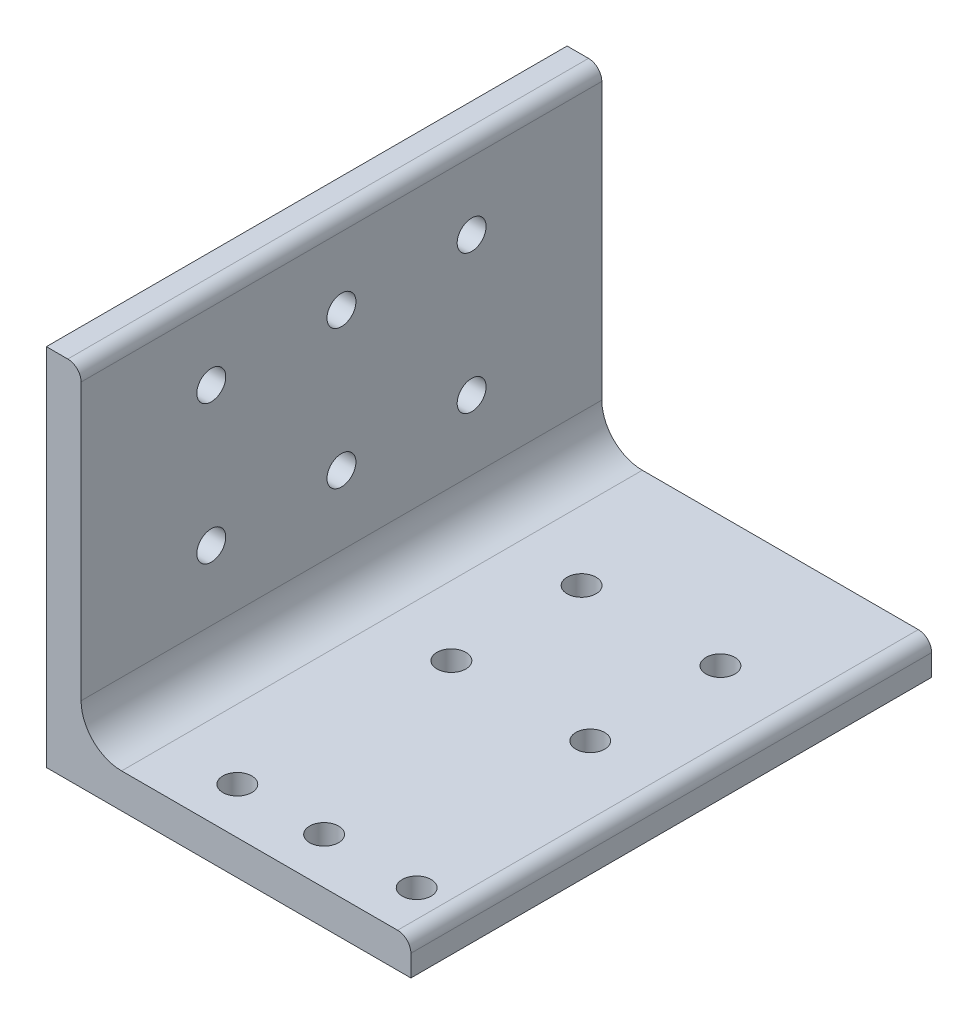
ISO-10303-21;
HEADER;
FILE_DESCRIPTION(('STEP AP214'),'2;1');
FILE_NAME('part.step','',(''),(''),'','','');
FILE_SCHEMA(('AUTOMOTIVE_DESIGN { 1 0 10303 214 1 1 1 1 }'));
ENDSEC;
DATA;
#1=APPLICATION_CONTEXT('core data for automotive mechanical design processes');
#2=APPLICATION_PROTOCOL_DEFINITION('international standard','automotive_design',2000,#1);
#3=PRODUCT_CONTEXT('',#1,'mechanical');
#4=PRODUCT('Part','Part','',(#3));
#5=PRODUCT_RELATED_PRODUCT_CATEGORY('part','',(#4));
#6=PRODUCT_DEFINITION_FORMATION('','',#4);
#7=PRODUCT_DEFINITION_CONTEXT('part definition',#1,'design');
#8=PRODUCT_DEFINITION('design','',#6,#7);
#9=PRODUCT_DEFINITION_SHAPE('','',#8);
#10=(LENGTH_UNIT() NAMED_UNIT(*) SI_UNIT(.MILLI.,.METRE.));
#11=(NAMED_UNIT(*) PLANE_ANGLE_UNIT() SI_UNIT($,.RADIAN.));
#12=(NAMED_UNIT(*) SI_UNIT($,.STERADIAN.) SOLID_ANGLE_UNIT());
#13=UNCERTAINTY_MEASURE_WITH_UNIT(LENGTH_MEASURE(1.E-05),#10,'distance_accuracy_value','');
#14=(GEOMETRIC_REPRESENTATION_CONTEXT(3) GLOBAL_UNCERTAINTY_ASSIGNED_CONTEXT((#13)) GLOBAL_UNIT_ASSIGNED_CONTEXT((#10,
#11,#12)) REPRESENTATION_CONTEXT('',''));
#15=CARTESIAN_POINT('',(0.,0.,0.));
#16=DIRECTION('',(0.,0.,1.));
#17=DIRECTION('',(1.,0.,0.));
#18=AXIS2_PLACEMENT_3D('',#15,#16,#17);
#19=CARTESIAN_POINT('',(0.,0.,90.));
#20=DIRECTION('',(-1.,0.,0.));
#21=DIRECTION('',(0.,0.,1.));
#22=AXIS2_PLACEMENT_3D('',#19,#20,#21);
#23=PLANE('',#22);
#24=CARTESIAN_POINT('',(0.,25.,67.5));
#25=DIRECTION('',(1.,0.,0.));
#26=DIRECTION('',(0.,0.,-1.));
#27=AXIS2_PLACEMENT_3D('',#24,#25,#26);
#28=CIRCLE('',#27,2.5);
#29=CARTESIAN_POINT('',(0.,25.,65.));
#30=VERTEX_POINT('',#29);
#31=EDGE_CURVE('E294',#30,#30,#28,.T.);
#32=ORIENTED_EDGE('',*,*,#31,.T.);
#33=EDGE_LOOP('',(#32));
#34=FACE_BOUND('',#33,.T.);
#35=DIRECTION('',(0.,1.,0.));
#36=VECTOR('',#35,1.);
#37=CARTESIAN_POINT('',(0.,0.,0.));
#38=LINE('',#37,#36);
#39=CARTESIAN_POINT('',(0.,0.,0.));
#40=VERTEX_POINT('',#39);
#41=CARTESIAN_POINT('',(0.,63.,0.));
#42=VERTEX_POINT('',#41);
#43=EDGE_CURVE('E145',#40,#42,#38,.T.);
#44=ORIENTED_EDGE('',*,*,#43,.F.);
#45=DIRECTION('',(0.,0.,-1.));
#46=VECTOR('',#45,1.);
#47=CARTESIAN_POINT('',(0.,0.,90.));
#48=LINE('',#47,#46);
#49=CARTESIAN_POINT('',(0.,0.,90.));
#50=VERTEX_POINT('',#49);
#51=EDGE_CURVE('E160',#50,#40,#48,.T.);
#52=ORIENTED_EDGE('',*,*,#51,.F.);
#53=DIRECTION('',(0.,1.,0.));
#54=VECTOR('',#53,1.);
#55=CARTESIAN_POINT('',(0.,0.,90.));
#56=LINE('',#55,#54);
#57=CARTESIAN_POINT('',(0.,63.,90.));
#58=VERTEX_POINT('',#57);
#59=EDGE_CURVE('E252',#50,#58,#56,.T.);
#60=ORIENTED_EDGE('',*,*,#59,.T.);
#61=DIRECTION('',(0.,0.,-1.));
#62=VECTOR('',#61,1.);
#63=CARTESIAN_POINT('',(0.,63.,90.));
#64=LINE('',#63,#62);
#65=EDGE_CURVE('E162',#58,#42,#64,.T.);
#66=ORIENTED_EDGE('',*,*,#65,.T.);
#67=EDGE_LOOP('',(#44,#52,#60,#66));
#68=FACE_BOUND('',#67,.T.);
#69=CARTESIAN_POINT('',(0.,49.,22.5000000000001));
#70=DIRECTION('',(1.,0.,0.));
#71=DIRECTION('',(0.,0.,-1.));
#72=AXIS2_PLACEMENT_3D('',#69,#70,#71);
#73=CIRCLE('',#72,2.5);
#74=CARTESIAN_POINT('',(0.,49.,20.0000000000001));
#75=VERTEX_POINT('',#74);
#76=EDGE_CURVE('E136',#75,#75,#73,.T.);
#77=ORIENTED_EDGE('',*,*,#76,.T.);
#78=EDGE_LOOP('',(#77));
#79=FACE_BOUND('',#78,.T.);
#80=CARTESIAN_POINT('',(0.,25.,22.5));
#81=DIRECTION('',(1.,0.,0.));
#82=DIRECTION('',(0.,0.,-1.));
#83=AXIS2_PLACEMENT_3D('',#80,#81,#82);
#84=CIRCLE('',#83,2.5);
#85=CARTESIAN_POINT('',(0.,25.,20.));
#86=VERTEX_POINT('',#85);
#87=EDGE_CURVE('E238',#86,#86,#84,.T.);
#88=ORIENTED_EDGE('',*,*,#87,.T.);
#89=EDGE_LOOP('',(#88));
#90=FACE_BOUND('',#89,.T.);
#91=CARTESIAN_POINT('',(0.,25.,45.));
#92=DIRECTION('',(1.,0.,0.));
#93=DIRECTION('',(0.,0.,-1.));
#94=AXIS2_PLACEMENT_3D('',#91,#92,#93);
#95=CIRCLE('',#94,2.5);
#96=CARTESIAN_POINT('',(0.,25.,42.5));
#97=VERTEX_POINT('',#96);
#98=EDGE_CURVE('E310',#97,#97,#95,.T.);
#99=ORIENTED_EDGE('',*,*,#98,.T.);
#100=EDGE_LOOP('',(#99));
#101=FACE_BOUND('',#100,.T.);
#102=CARTESIAN_POINT('',(0.,49.,45.));
#103=DIRECTION('',(1.,0.,0.));
#104=DIRECTION('',(0.,0.,-1.));
#105=AXIS2_PLACEMENT_3D('',#102,#103,#104);
#106=CIRCLE('',#105,2.5);
#107=CARTESIAN_POINT('',(0.,49.,42.5));
#108=VERTEX_POINT('',#107);
#109=EDGE_CURVE('E306',#108,#108,#106,.T.);
#110=ORIENTED_EDGE('',*,*,#109,.T.);
#111=EDGE_LOOP('',(#110));
#112=FACE_BOUND('',#111,.T.);
#113=CARTESIAN_POINT('',(0.,49.,67.5));
#114=DIRECTION('',(1.,0.,0.));
#115=DIRECTION('',(0.,0.,-1.));
#116=AXIS2_PLACEMENT_3D('',#113,#114,#115);
#117=CIRCLE('',#116,2.5);
#118=CARTESIAN_POINT('',(0.,49.,65.));
#119=VERTEX_POINT('',#118);
#120=EDGE_CURVE('E302',#119,#119,#117,.T.);
#121=ORIENTED_EDGE('',*,*,#120,.T.);
#122=EDGE_LOOP('',(#121));
#123=FACE_BOUND('',#122,.T.);
#124=ADVANCED_FACE('F32',(#34,#68,#79,#90,#101,#112,#123),#23,.T.);
#125=CARTESIAN_POINT('',(13.,13.,90.));
#126=DIRECTION('',(0.,0.,-1.));
#127=DIRECTION('',(-1.,0.,0.));
#128=AXIS2_PLACEMENT_3D('',#125,#126,#127);
#129=CYLINDRICAL_SURFACE('',#128,7.);
#130=CARTESIAN_POINT('',(13.,13.,0.));
#131=DIRECTION('',(0.,0.,1.));
#132=DIRECTION('',(1.,0.,0.));
#133=AXIS2_PLACEMENT_3D('',#130,#131,#132);
#134=CIRCLE('',#133,7.);
#135=CARTESIAN_POINT('',(6.,13.,0.));
#136=VERTEX_POINT('',#135);
#137=CARTESIAN_POINT('',(13.,6.,0.));
#138=VERTEX_POINT('',#137);
#139=EDGE_CURVE('E133',#136,#138,#134,.T.);
#140=ORIENTED_EDGE('',*,*,#139,.F.);
#141=DIRECTION('',(0.,0.,-1.));
#142=VECTOR('',#141,1.);
#143=CARTESIAN_POINT('',(6.,13.,90.));
#144=LINE('',#143,#142);
#145=CARTESIAN_POINT('',(6.,13.,90.));
#146=VERTEX_POINT('',#145);
#147=EDGE_CURVE('E11',#146,#136,#144,.T.);
#148=ORIENTED_EDGE('',*,*,#147,.F.);
#149=CARTESIAN_POINT('',(13.,13.,90.));
#150=DIRECTION('',(0.,0.,1.));
#151=DIRECTION('',(1.,0.,0.));
#152=AXIS2_PLACEMENT_3D('',#149,#150,#151);
#153=CIRCLE('',#152,7.);
#154=CARTESIAN_POINT('',(13.,6.,90.));
#155=VERTEX_POINT('',#154);
#156=EDGE_CURVE('E156',#146,#155,#153,.T.);
#157=ORIENTED_EDGE('',*,*,#156,.T.);
#158=DIRECTION('',(0.,0.,-1.));
#159=VECTOR('',#158,1.);
#160=CARTESIAN_POINT('',(13.,6.,90.));
#161=LINE('',#160,#159);
#162=EDGE_CURVE('E49',#155,#138,#161,.T.);
#163=ORIENTED_EDGE('',*,*,#162,.T.);
#164=EDGE_LOOP('',(#140,#148,#157,#163));
#165=FACE_BOUND('',#164,.T.);
#166=ADVANCED_FACE('F34',(#165),#129,.F.);
#167=CARTESIAN_POINT('',(6.,0.,90.));
#168=DIRECTION('',(1.,0.,0.));
#169=DIRECTION('',(0.,1.,0.));
#170=AXIS2_PLACEMENT_3D('',#167,#168,#169);
#171=PLANE('',#170);
#172=CARTESIAN_POINT('',(6.,25.,67.5));
#173=DIRECTION('',(1.,0.,0.));
#174=DIRECTION('',(0.,0.,-1.));
#175=AXIS2_PLACEMENT_3D('',#172,#173,#174);
#176=CIRCLE('',#175,2.5);
#177=CARTESIAN_POINT('',(6.,25.,65.));
#178=VERTEX_POINT('',#177);
#179=EDGE_CURVE('E217',#178,#178,#176,.T.);
#180=ORIENTED_EDGE('',*,*,#179,.F.);
#181=EDGE_LOOP('',(#180));
#182=FACE_BOUND('',#181,.T.);
#183=CARTESIAN_POINT('',(6.,49.,67.5));
#184=DIRECTION('',(1.,0.,0.));
#185=DIRECTION('',(0.,0.,-1.));
#186=AXIS2_PLACEMENT_3D('',#183,#184,#185);
#187=CIRCLE('',#186,2.5);
#188=CARTESIAN_POINT('',(6.,49.,65.));
#189=VERTEX_POINT('',#188);
#190=EDGE_CURVE('E221',#189,#189,#187,.T.);
#191=ORIENTED_EDGE('',*,*,#190,.F.);
#192=EDGE_LOOP('',(#191));
#193=FACE_BOUND('',#192,.T.);
#194=CARTESIAN_POINT('',(6.,49.,45.));
#195=DIRECTION('',(1.,0.,0.));
#196=DIRECTION('',(0.,0.,-1.));
#197=AXIS2_PLACEMENT_3D('',#194,#195,#196);
#198=CIRCLE('',#197,2.5);
#199=CARTESIAN_POINT('',(6.,49.,42.5));
#200=VERTEX_POINT('',#199);
#201=EDGE_CURVE('E225',#200,#200,#198,.T.);
#202=ORIENTED_EDGE('',*,*,#201,.F.);
#203=EDGE_LOOP('',(#202));
#204=FACE_BOUND('',#203,.T.);
#205=CARTESIAN_POINT('',(6.,25.,45.));
#206=DIRECTION('',(1.,0.,0.));
#207=DIRECTION('',(0.,0.,-1.));
#208=AXIS2_PLACEMENT_3D('',#205,#206,#207);
#209=CIRCLE('',#208,2.5);
#210=CARTESIAN_POINT('',(6.,25.,42.5));
#211=VERTEX_POINT('',#210);
#212=EDGE_CURVE('E229',#211,#211,#209,.T.);
#213=ORIENTED_EDGE('',*,*,#212,.F.);
#214=EDGE_LOOP('',(#213));
#215=FACE_BOUND('',#214,.T.);
#216=CARTESIAN_POINT('',(6.,25.,22.5));
#217=DIRECTION('',(1.,0.,0.));
#218=DIRECTION('',(0.,0.,-1.));
#219=AXIS2_PLACEMENT_3D('',#216,#217,#218);
#220=CIRCLE('',#219,2.5);
#221=CARTESIAN_POINT('',(6.,25.,20.));
#222=VERTEX_POINT('',#221);
#223=EDGE_CURVE('E233',#222,#222,#220,.T.);
#224=ORIENTED_EDGE('',*,*,#223,.F.);
#225=EDGE_LOOP('',(#224));
#226=FACE_BOUND('',#225,.T.);
#227=CARTESIAN_POINT('',(6.,49.,22.5000000000001));
#228=DIRECTION('',(1.,0.,0.));
#229=DIRECTION('',(0.,0.,-1.));
#230=AXIS2_PLACEMENT_3D('',#227,#228,#229);
#231=CIRCLE('',#230,2.5);
#232=CARTESIAN_POINT('',(6.,49.,20.0000000000001));
#233=VERTEX_POINT('',#232);
#234=EDGE_CURVE('E236',#233,#233,#231,.T.);
#235=ORIENTED_EDGE('',*,*,#234,.F.);
#236=EDGE_LOOP('',(#235));
#237=FACE_BOUND('',#236,.T.);
#238=DIRECTION('',(0.,-1.,0.));
#239=VECTOR('',#238,1.);
#240=CARTESIAN_POINT('',(6.,0.,0.));
#241=LINE('',#240,#239);
#242=CARTESIAN_POINT('',(6.,60.7,0.));
#243=VERTEX_POINT('',#242);
#244=EDGE_CURVE('E135',#243,#136,#241,.T.);
#245=ORIENTED_EDGE('',*,*,#244,.F.);
#246=DIRECTION('',(0.,0.,-1.));
#247=VECTOR('',#246,1.);
#248=CARTESIAN_POINT('',(6.,60.7,90.));
#249=LINE('',#248,#247);
#250=CARTESIAN_POINT('',(6.,60.7,90.));
#251=VERTEX_POINT('',#250);
#252=EDGE_CURVE('E41',#251,#243,#249,.T.);
#253=ORIENTED_EDGE('',*,*,#252,.F.);
#254=DIRECTION('',(0.,-1.,0.));
#255=VECTOR('',#254,1.);
#256=CARTESIAN_POINT('',(6.,0.,90.));
#257=LINE('',#256,#255);
#258=EDGE_CURVE('E179',#251,#146,#257,.T.);
#259=ORIENTED_EDGE('',*,*,#258,.T.);
#260=ORIENTED_EDGE('',*,*,#147,.T.);
#261=EDGE_LOOP('',(#245,#253,#259,#260));
#262=FACE_BOUND('',#261,.T.);
#263=ADVANCED_FACE('F178',(#182,#193,#204,#215,#226,#237,#262),#171,.T.);
#264=CARTESIAN_POINT('',(3.7,60.7,90.));
#265=DIRECTION('',(0.,0.,-1.));
#266=DIRECTION('',(-1.,0.,0.));
#267=AXIS2_PLACEMENT_3D('',#264,#265,#266);
#268=CYLINDRICAL_SURFACE('',#267,2.3);
#269=CARTESIAN_POINT('',(3.7,60.7,0.));
#270=DIRECTION('',(0.,0.,1.));
#271=DIRECTION('',(1.,0.,0.));
#272=AXIS2_PLACEMENT_3D('',#269,#270,#271);
#273=CIRCLE('',#272,2.3);
#274=CARTESIAN_POINT('',(3.69999999999999,63.,0.));
#275=VERTEX_POINT('',#274);
#276=EDGE_CURVE('E139',#243,#275,#273,.T.);
#277=ORIENTED_EDGE('',*,*,#276,.T.);
#278=DIRECTION('',(0.,0.,-1.));
#279=VECTOR('',#278,1.);
#280=CARTESIAN_POINT('',(3.69999999999999,63.,90.));
#281=LINE('',#280,#279);
#282=CARTESIAN_POINT('',(3.69999999999999,63.,90.));
#283=VERTEX_POINT('',#282);
#284=EDGE_CURVE('E164',#283,#275,#281,.T.);
#285=ORIENTED_EDGE('',*,*,#284,.F.);
#286=CARTESIAN_POINT('',(3.7,60.7,90.));
#287=DIRECTION('',(0.,0.,1.));
#288=DIRECTION('',(1.,0.,0.));
#289=AXIS2_PLACEMENT_3D('',#286,#287,#288);
#290=CIRCLE('',#289,2.3);
#291=EDGE_CURVE('E170',#251,#283,#290,.T.);
#292=ORIENTED_EDGE('',*,*,#291,.F.);
#293=ORIENTED_EDGE('',*,*,#252,.T.);
#294=EDGE_LOOP('',(#277,#285,#292,#293));
#295=FACE_BOUND('',#294,.T.);
#296=ADVANCED_FACE('F168',(#295),#268,.T.);
#297=CARTESIAN_POINT('',(0.,63.,90.));
#298=DIRECTION('',(0.,1.,0.));
#299=DIRECTION('',(0.,0.,1.));
#300=AXIS2_PLACEMENT_3D('',#297,#298,#299);
#301=PLANE('',#300);
#302=DIRECTION('',(1.,0.,0.));
#303=VECTOR('',#302,1.);
#304=CARTESIAN_POINT('',(0.,63.,0.));
#305=LINE('',#304,#303);
#306=EDGE_CURVE('E142',#42,#275,#305,.T.);
#307=ORIENTED_EDGE('',*,*,#306,.F.);
#308=ORIENTED_EDGE('',*,*,#65,.F.);
#309=DIRECTION('',(1.,0.,0.));
#310=VECTOR('',#309,1.);
#311=CARTESIAN_POINT('',(0.,63.,90.));
#312=LINE('',#311,#310);
#313=EDGE_CURVE('E249',#58,#283,#312,.T.);
#314=ORIENTED_EDGE('',*,*,#313,.T.);
#315=ORIENTED_EDGE('',*,*,#284,.T.);
#316=EDGE_LOOP('',(#307,#308,#314,#315));
#317=FACE_BOUND('',#316,.T.);
#318=ADVANCED_FACE('F205',(#317),#301,.T.);
#319=CARTESIAN_POINT('',(0.,0.,90.));
#320=DIRECTION('',(0.,1.,0.));
#321=DIRECTION('',(0.,0.,1.));
#322=AXIS2_PLACEMENT_3D('',#319,#320,#321);
#323=PLANE('',#322);
#324=CARTESIAN_POINT('',(56.,0.,82.));
#325=DIRECTION('',(0.,1.,0.));
#326=DIRECTION('',(0.,0.,1.));
#327=AXIS2_PLACEMENT_3D('',#324,#325,#326);
#328=CIRCLE('',#327,2.5);
#329=CARTESIAN_POINT('',(56.,0.,84.5));
#330=VERTEX_POINT('',#329);
#331=EDGE_CURVE('E267',#330,#330,#328,.T.);
#332=ORIENTED_EDGE('',*,*,#331,.T.);
#333=EDGE_LOOP('',(#332));
#334=FACE_BOUND('',#333,.T.);
#335=CARTESIAN_POINT('',(40.,0.,82.));
#336=DIRECTION('',(0.,1.,0.));
#337=DIRECTION('',(0.,0.,1.));
#338=AXIS2_PLACEMENT_3D('',#335,#336,#337);
#339=CIRCLE('',#338,2.5);
#340=CARTESIAN_POINT('',(40.,0.,84.5));
#341=VERTEX_POINT('',#340);
#342=EDGE_CURVE('E271',#341,#341,#339,.T.);
#343=ORIENTED_EDGE('',*,*,#342,.T.);
#344=EDGE_LOOP('',(#343));
#345=FACE_BOUND('',#344,.T.);
#346=CARTESIAN_POINT('',(25.,0.,22.5));
#347=DIRECTION('',(0.,1.,0.));
#348=DIRECTION('',(0.,0.,1.));
#349=AXIS2_PLACEMENT_3D('',#346,#347,#348);
#350=CIRCLE('',#349,2.5);
#351=CARTESIAN_POINT('',(25.,0.,25.));
#352=VERTEX_POINT('',#351);
#353=EDGE_CURVE('E275',#352,#352,#350,.T.);
#354=ORIENTED_EDGE('',*,*,#353,.T.);
#355=EDGE_LOOP('',(#354));
#356=FACE_BOUND('',#355,.T.);
#357=CARTESIAN_POINT('',(49.,0.,22.5));
#358=DIRECTION('',(0.,1.,0.));
#359=DIRECTION('',(0.,0.,1.));
#360=AXIS2_PLACEMENT_3D('',#357,#358,#359);
#361=CIRCLE('',#360,2.5);
#362=CARTESIAN_POINT('',(49.,0.,25.));
#363=VERTEX_POINT('',#362);
#364=EDGE_CURVE('E279',#363,#363,#361,.T.);
#365=ORIENTED_EDGE('',*,*,#364,.T.);
#366=EDGE_LOOP('',(#365));
#367=FACE_BOUND('',#366,.T.);
#368=CARTESIAN_POINT('',(49.,0.,45.));
#369=DIRECTION('',(0.,1.,0.));
#370=DIRECTION('',(0.,0.,1.));
#371=AXIS2_PLACEMENT_3D('',#368,#369,#370);
#372=CIRCLE('',#371,2.5);
#373=CARTESIAN_POINT('',(49.,0.,47.5));
#374=VERTEX_POINT('',#373);
#375=EDGE_CURVE('E283',#374,#374,#372,.T.);
#376=ORIENTED_EDGE('',*,*,#375,.T.);
#377=EDGE_LOOP('',(#376));
#378=FACE_BOUND('',#377,.T.);
#379=CARTESIAN_POINT('',(25.,0.,45.));
#380=DIRECTION('',(0.,1.,0.));
#381=DIRECTION('',(0.,0.,1.));
#382=AXIS2_PLACEMENT_3D('',#379,#380,#381);
#383=CIRCLE('',#382,2.5);
#384=CARTESIAN_POINT('',(25.,0.,47.5));
#385=VERTEX_POINT('',#384);
#386=EDGE_CURVE('E287',#385,#385,#383,.T.);
#387=ORIENTED_EDGE('',*,*,#386,.T.);
#388=EDGE_LOOP('',(#387));
#389=FACE_BOUND('',#388,.T.);
#390=CARTESIAN_POINT('',(25.,0.,82.));
#391=DIRECTION('',(0.,1.,0.));
#392=DIRECTION('',(0.,0.,1.));
#393=AXIS2_PLACEMENT_3D('',#390,#391,#392);
#394=CIRCLE('',#393,2.5);
#395=CARTESIAN_POINT('',(25.,0.,84.5));
#396=VERTEX_POINT('',#395);
#397=EDGE_CURVE('E290',#396,#396,#394,.T.);
#398=ORIENTED_EDGE('',*,*,#397,.T.);
#399=EDGE_LOOP('',(#398));
#400=FACE_BOUND('',#399,.T.);
#401=DIRECTION('',(1.,0.,0.));
#402=VECTOR('',#401,1.);
#403=CARTESIAN_POINT('',(0.,0.,0.));
#404=LINE('',#403,#402);
#405=CARTESIAN_POINT('',(63.,0.,0.));
#406=VERTEX_POINT('',#405);
#407=EDGE_CURVE('E148',#40,#406,#404,.T.);
#408=ORIENTED_EDGE('',*,*,#407,.T.);
#409=DIRECTION('',(0.,0.,-1.));
#410=VECTOR('',#409,1.);
#411=CARTESIAN_POINT('',(63.,0.,90.));
#412=LINE('',#411,#410);
#413=CARTESIAN_POINT('',(63.,0.,90.));
#414=VERTEX_POINT('',#413);
#415=EDGE_CURVE('E125',#414,#406,#412,.T.);
#416=ORIENTED_EDGE('',*,*,#415,.F.);
#417=DIRECTION('',(1.,0.,0.));
#418=VECTOR('',#417,1.);
#419=CARTESIAN_POINT('',(0.,0.,90.));
#420=LINE('',#419,#418);
#421=EDGE_CURVE('E113',#50,#414,#420,.T.);
#422=ORIENTED_EDGE('',*,*,#421,.F.);
#423=ORIENTED_EDGE('',*,*,#51,.T.);
#424=EDGE_LOOP('',(#408,#416,#422,#423));
#425=FACE_BOUND('',#424,.T.);
#426=ADVANCED_FACE('F203',(#334,#345,#356,#367,#378,#389,#400,#425),#323,.F.);
#427=CARTESIAN_POINT('',(63.,0.,90.));
#428=DIRECTION('',(-1.,0.,0.));
#429=DIRECTION('',(0.,0.,1.));
#430=AXIS2_PLACEMENT_3D('',#427,#428,#429);
#431=PLANE('',#430);
#432=DIRECTION('',(0.,1.,0.));
#433=VECTOR('',#432,1.);
#434=CARTESIAN_POINT('',(63.,0.,0.));
#435=LINE('',#434,#433);
#436=CARTESIAN_POINT('',(63.,3.69999999999998,0.));
#437=VERTEX_POINT('',#436);
#438=EDGE_CURVE('E122',#406,#437,#435,.T.);
#439=ORIENTED_EDGE('',*,*,#438,.T.);
#440=DIRECTION('',(0.,0.,-1.));
#441=VECTOR('',#440,1.);
#442=CARTESIAN_POINT('',(63.,3.69999999999998,90.));
#443=LINE('',#442,#441);
#444=CARTESIAN_POINT('',(63.,3.69999999999998,90.));
#445=VERTEX_POINT('',#444);
#446=EDGE_CURVE('E119',#445,#437,#443,.T.);
#447=ORIENTED_EDGE('',*,*,#446,.F.);
#448=DIRECTION('',(0.,1.,0.));
#449=VECTOR('',#448,1.);
#450=CARTESIAN_POINT('',(63.,0.,90.));
#451=LINE('',#450,#449);
#452=EDGE_CURVE('E105',#414,#445,#451,.T.);
#453=ORIENTED_EDGE('',*,*,#452,.F.);
#454=ORIENTED_EDGE('',*,*,#415,.T.);
#455=EDGE_LOOP('',(#439,#447,#453,#454));
#456=FACE_BOUND('',#455,.T.);
#457=ADVANCED_FACE('F120',(#456),#431,.F.);
#458=CARTESIAN_POINT('',(60.7,3.7,90.));
#459=DIRECTION('',(0.,0.,-1.));
#460=DIRECTION('',(-1.,0.,0.));
#461=AXIS2_PLACEMENT_3D('',#458,#459,#460);
#462=CYLINDRICAL_SURFACE('',#461,2.3);
#463=CARTESIAN_POINT('',(60.7,3.7,0.));
#464=DIRECTION('',(0.,0.,1.));
#465=DIRECTION('',(1.,0.,0.));
#466=AXIS2_PLACEMENT_3D('',#463,#464,#465);
#467=CIRCLE('',#466,2.3);
#468=CARTESIAN_POINT('',(60.7,6.,0.));
#469=VERTEX_POINT('',#468);
#470=EDGE_CURVE('E151',#437,#469,#467,.T.);
#471=ORIENTED_EDGE('',*,*,#470,.T.);
#472=DIRECTION('',(0.,0.,-1.));
#473=VECTOR('',#472,1.);
#474=CARTESIAN_POINT('',(60.7,6.,90.));
#475=LINE('',#474,#473);
#476=CARTESIAN_POINT('',(60.7,6.,90.));
#477=VERTEX_POINT('',#476);
#478=EDGE_CURVE('E78',#477,#469,#475,.T.);
#479=ORIENTED_EDGE('',*,*,#478,.F.);
#480=CARTESIAN_POINT('',(60.7,3.7,90.));
#481=DIRECTION('',(0.,0.,1.));
#482=DIRECTION('',(1.,0.,0.));
#483=AXIS2_PLACEMENT_3D('',#480,#481,#482);
#484=CIRCLE('',#483,2.3);
#485=EDGE_CURVE('E110',#445,#477,#484,.T.);
#486=ORIENTED_EDGE('',*,*,#485,.F.);
#487=ORIENTED_EDGE('',*,*,#446,.T.);
#488=EDGE_LOOP('',(#471,#479,#486,#487));
#489=FACE_BOUND('',#488,.T.);
#490=ADVANCED_FACE('F127',(#489),#462,.T.);
#491=CARTESIAN_POINT('',(0.,6.,90.));
#492=DIRECTION('',(0.,1.,0.));
#493=DIRECTION('',(0.,0.,1.));
#494=AXIS2_PLACEMENT_3D('',#491,#492,#493);
#495=PLANE('',#494);
#496=CARTESIAN_POINT('',(56.,6.,82.));
#497=DIRECTION('',(0.,1.,0.));
#498=DIRECTION('',(0.,0.,1.));
#499=AXIS2_PLACEMENT_3D('',#496,#497,#498);
#500=CIRCLE('',#499,2.5);
#501=CARTESIAN_POINT('',(56.,6.,84.5));
#502=VERTEX_POINT('',#501);
#503=EDGE_CURVE('E467',#502,#502,#500,.T.);
#504=ORIENTED_EDGE('',*,*,#503,.F.);
#505=EDGE_LOOP('',(#504));
#506=FACE_BOUND('',#505,.T.);
#507=CARTESIAN_POINT('',(40.,6.,82.));
#508=DIRECTION('',(0.,1.,0.));
#509=DIRECTION('',(0.,0.,1.));
#510=AXIS2_PLACEMENT_3D('',#507,#508,#509);
#511=CIRCLE('',#510,2.5);
#512=CARTESIAN_POINT('',(40.,6.,84.5));
#513=VERTEX_POINT('',#512);
#514=EDGE_CURVE('E469',#513,#513,#511,.T.);
#515=ORIENTED_EDGE('',*,*,#514,.F.);
#516=EDGE_LOOP('',(#515));
#517=FACE_BOUND('',#516,.T.);
#518=CARTESIAN_POINT('',(25.,6.,22.5));
#519=DIRECTION('',(0.,1.,0.));
#520=DIRECTION('',(0.,0.,1.));
#521=AXIS2_PLACEMENT_3D('',#518,#519,#520);
#522=CIRCLE('',#521,2.5);
#523=CARTESIAN_POINT('',(25.,6.,25.));
#524=VERTEX_POINT('',#523);
#525=EDGE_CURVE('E475',#524,#524,#522,.T.);
#526=ORIENTED_EDGE('',*,*,#525,.F.);
#527=EDGE_LOOP('',(#526));
#528=FACE_BOUND('',#527,.T.);
#529=CARTESIAN_POINT('',(49.,6.,22.5));
#530=DIRECTION('',(0.,1.,0.));
#531=DIRECTION('',(0.,0.,1.));
#532=AXIS2_PLACEMENT_3D('',#529,#530,#531);
#533=CIRCLE('',#532,2.5);
#534=CARTESIAN_POINT('',(49.,6.,25.));
#535=VERTEX_POINT('',#534);
#536=EDGE_CURVE('E479',#535,#535,#533,.T.);
#537=ORIENTED_EDGE('',*,*,#536,.F.);
#538=EDGE_LOOP('',(#537));
#539=FACE_BOUND('',#538,.T.);
#540=CARTESIAN_POINT('',(49.,6.,45.));
#541=DIRECTION('',(0.,1.,0.));
#542=DIRECTION('',(0.,0.,1.));
#543=AXIS2_PLACEMENT_3D('',#540,#541,#542);
#544=CIRCLE('',#543,2.5);
#545=CARTESIAN_POINT('',(49.,6.,47.5));
#546=VERTEX_POINT('',#545);
#547=EDGE_CURVE('E483',#546,#546,#544,.T.);
#548=ORIENTED_EDGE('',*,*,#547,.F.);
#549=EDGE_LOOP('',(#548));
#550=FACE_BOUND('',#549,.T.);
#551=CARTESIAN_POINT('',(25.,6.,45.));
#552=DIRECTION('',(0.,1.,0.));
#553=DIRECTION('',(0.,0.,1.));
#554=AXIS2_PLACEMENT_3D('',#551,#552,#553);
#555=CIRCLE('',#554,2.5);
#556=CARTESIAN_POINT('',(25.,6.,47.5));
#557=VERTEX_POINT('',#556);
#558=EDGE_CURVE('E487',#557,#557,#555,.T.);
#559=ORIENTED_EDGE('',*,*,#558,.F.);
#560=EDGE_LOOP('',(#559));
#561=FACE_BOUND('',#560,.T.);
#562=CARTESIAN_POINT('',(25.,6.,82.));
#563=DIRECTION('',(0.,1.,0.));
#564=DIRECTION('',(0.,0.,1.));
#565=AXIS2_PLACEMENT_3D('',#562,#563,#564);
#566=CIRCLE('',#565,2.5);
#567=CARTESIAN_POINT('',(25.,6.,84.5));
#568=VERTEX_POINT('',#567);
#569=EDGE_CURVE('E292',#568,#568,#566,.T.);
#570=ORIENTED_EDGE('',*,*,#569,.F.);
#571=EDGE_LOOP('',(#570));
#572=FACE_BOUND('',#571,.T.);
#573=DIRECTION('',(1.,0.,0.));
#574=VECTOR('',#573,1.);
#575=CARTESIAN_POINT('',(0.,6.,0.));
#576=LINE('',#575,#574);
#577=EDGE_CURVE('E153',#138,#469,#576,.T.);
#578=ORIENTED_EDGE('',*,*,#577,.F.);
#579=ORIENTED_EDGE('',*,*,#162,.F.);
#580=DIRECTION('',(1.,0.,0.));
#581=VECTOR('',#580,1.);
#582=CARTESIAN_POINT('',(0.,6.,90.));
#583=LINE('',#582,#581);
#584=EDGE_CURVE('E128',#155,#477,#583,.T.);
#585=ORIENTED_EDGE('',*,*,#584,.T.);
#586=ORIENTED_EDGE('',*,*,#478,.T.);
#587=EDGE_LOOP('',(#578,#579,#585,#586));
#588=FACE_BOUND('',#587,.T.);
#589=ADVANCED_FACE('F180',(#506,#517,#528,#539,#550,#561,#572,#588),#495,.T.);
#590=CARTESIAN_POINT('',(0.,0.,90.));
#591=DIRECTION('',(0.,0.,1.));
#592=DIRECTION('',(1.,0.,0.));
#593=AXIS2_PLACEMENT_3D('',#590,#591,#592);
#594=PLANE('',#593);
#595=ORIENTED_EDGE('',*,*,#156,.F.);
#596=ORIENTED_EDGE('',*,*,#258,.F.);
#597=ORIENTED_EDGE('',*,*,#291,.T.);
#598=ORIENTED_EDGE('',*,*,#313,.F.);
#599=ORIENTED_EDGE('',*,*,#59,.F.);
#600=ORIENTED_EDGE('',*,*,#421,.T.);
#601=ORIENTED_EDGE('',*,*,#452,.T.);
#602=ORIENTED_EDGE('',*,*,#485,.T.);
#603=ORIENTED_EDGE('',*,*,#584,.F.);
#604=EDGE_LOOP('',(#595,#596,#597,#598,#599,#600,#601,#602,#603));
#605=FACE_BOUND('',#604,.T.);
#606=ADVANCED_FACE('F107',(#605),#594,.T.);
#607=CARTESIAN_POINT('',(0.,0.,0.));
#608=DIRECTION('',(0.,0.,1.));
#609=DIRECTION('',(1.,0.,0.));
#610=AXIS2_PLACEMENT_3D('',#607,#608,#609);
#611=PLANE('',#610);
#612=ORIENTED_EDGE('',*,*,#139,.T.);
#613=ORIENTED_EDGE('',*,*,#577,.T.);
#614=ORIENTED_EDGE('',*,*,#470,.F.);
#615=ORIENTED_EDGE('',*,*,#438,.F.);
#616=ORIENTED_EDGE('',*,*,#407,.F.);
#617=ORIENTED_EDGE('',*,*,#43,.T.);
#618=ORIENTED_EDGE('',*,*,#306,.T.);
#619=ORIENTED_EDGE('',*,*,#276,.F.);
#620=ORIENTED_EDGE('',*,*,#244,.T.);
#621=EDGE_LOOP('',(#612,#613,#614,#615,#616,#617,#618,#619,#620));
#622=FACE_BOUND('',#621,.T.);
#623=ADVANCED_FACE('F176',(#622),#611,.F.);
#624=CARTESIAN_POINT('',(6.,49.,22.5000000000001));
#625=DIRECTION('',(1.,0.,0.));
#626=DIRECTION('',(0.,0.,-1.));
#627=AXIS2_PLACEMENT_3D('',#624,#625,#626);
#628=CYLINDRICAL_SURFACE('',#627,2.5);
#629=ORIENTED_EDGE('',*,*,#76,.F.);
#630=EDGE_LOOP('',(#629));
#631=FACE_BOUND('',#630,.T.);
#632=ORIENTED_EDGE('',*,*,#234,.T.);
#633=EDGE_LOOP('',(#632));
#634=FACE_BOUND('',#633,.T.);
#635=ADVANCED_FACE('F316',(#631,#634),#628,.F.);
#636=CARTESIAN_POINT('',(6.,25.,22.5));
#637=DIRECTION('',(1.,0.,0.));
#638=DIRECTION('',(0.,0.,-1.));
#639=AXIS2_PLACEMENT_3D('',#636,#637,#638);
#640=CYLINDRICAL_SURFACE('',#639,2.5);
#641=ORIENTED_EDGE('',*,*,#87,.F.);
#642=EDGE_LOOP('',(#641));
#643=FACE_BOUND('',#642,.T.);
#644=ORIENTED_EDGE('',*,*,#223,.T.);
#645=EDGE_LOOP('',(#644));
#646=FACE_BOUND('',#645,.T.);
#647=ADVANCED_FACE('F313',(#643,#646),#640,.F.);
#648=CARTESIAN_POINT('',(6.,25.,45.));
#649=DIRECTION('',(1.,0.,0.));
#650=DIRECTION('',(0.,0.,-1.));
#651=AXIS2_PLACEMENT_3D('',#648,#649,#650);
#652=CYLINDRICAL_SURFACE('',#651,2.5);
#653=ORIENTED_EDGE('',*,*,#98,.F.);
#654=EDGE_LOOP('',(#653));
#655=FACE_BOUND('',#654,.T.);
#656=ORIENTED_EDGE('',*,*,#212,.T.);
#657=EDGE_LOOP('',(#656));
#658=FACE_BOUND('',#657,.T.);
#659=ADVANCED_FACE('F315',(#655,#658),#652,.F.);
#660=CARTESIAN_POINT('',(6.,49.,45.));
#661=DIRECTION('',(1.,0.,0.));
#662=DIRECTION('',(0.,0.,-1.));
#663=AXIS2_PLACEMENT_3D('',#660,#661,#662);
#664=CYLINDRICAL_SURFACE('',#663,2.5);
#665=ORIENTED_EDGE('',*,*,#109,.F.);
#666=EDGE_LOOP('',(#665));
#667=FACE_BOUND('',#666,.T.);
#668=ORIENTED_EDGE('',*,*,#201,.T.);
#669=EDGE_LOOP('',(#668));
#670=FACE_BOUND('',#669,.T.);
#671=ADVANCED_FACE('F323',(#667,#670),#664,.F.);
#672=CARTESIAN_POINT('',(6.,49.,67.5));
#673=DIRECTION('',(1.,0.,0.));
#674=DIRECTION('',(0.,0.,-1.));
#675=AXIS2_PLACEMENT_3D('',#672,#673,#674);
#676=CYLINDRICAL_SURFACE('',#675,2.5);
#677=ORIENTED_EDGE('',*,*,#120,.F.);
#678=EDGE_LOOP('',(#677));
#679=FACE_BOUND('',#678,.T.);
#680=ORIENTED_EDGE('',*,*,#190,.T.);
#681=EDGE_LOOP('',(#680));
#682=FACE_BOUND('',#681,.T.);
#683=ADVANCED_FACE('F361',(#679,#682),#676,.F.);
#684=CARTESIAN_POINT('',(6.,25.,67.5));
#685=DIRECTION('',(1.,0.,0.));
#686=DIRECTION('',(0.,0.,-1.));
#687=AXIS2_PLACEMENT_3D('',#684,#685,#686);
#688=CYLINDRICAL_SURFACE('',#687,2.5);
#689=ORIENTED_EDGE('',*,*,#31,.F.);
#690=EDGE_LOOP('',(#689));
#691=FACE_BOUND('',#690,.T.);
#692=ORIENTED_EDGE('',*,*,#179,.T.);
#693=EDGE_LOOP('',(#692));
#694=FACE_BOUND('',#693,.T.);
#695=ADVANCED_FACE('F370',(#691,#694),#688,.F.);
#696=CARTESIAN_POINT('',(25.,6.,82.));
#697=DIRECTION('',(0.,1.,0.));
#698=DIRECTION('',(0.,0.,1.));
#699=AXIS2_PLACEMENT_3D('',#696,#697,#698);
#700=CYLINDRICAL_SURFACE('',#699,2.5);
#701=ORIENTED_EDGE('',*,*,#397,.F.);
#702=EDGE_LOOP('',(#701));
#703=FACE_BOUND('',#702,.T.);
#704=ORIENTED_EDGE('',*,*,#569,.T.);
#705=EDGE_LOOP('',(#704));
#706=FACE_BOUND('',#705,.T.);
#707=ADVANCED_FACE('F379',(#703,#706),#700,.F.);
#708=CARTESIAN_POINT('',(25.,6.,45.));
#709=DIRECTION('',(0.,1.,0.));
#710=DIRECTION('',(0.,0.,1.));
#711=AXIS2_PLACEMENT_3D('',#708,#709,#710);
#712=CYLINDRICAL_SURFACE('',#711,2.5);
#713=ORIENTED_EDGE('',*,*,#386,.F.);
#714=EDGE_LOOP('',(#713));
#715=FACE_BOUND('',#714,.T.);
#716=ORIENTED_EDGE('',*,*,#558,.T.);
#717=EDGE_LOOP('',(#716));
#718=FACE_BOUND('',#717,.T.);
#719=ADVANCED_FACE('F402',(#715,#718),#712,.F.);
#720=CARTESIAN_POINT('',(49.,6.,45.));
#721=DIRECTION('',(0.,1.,0.));
#722=DIRECTION('',(0.,0.,1.));
#723=AXIS2_PLACEMENT_3D('',#720,#721,#722);
#724=CYLINDRICAL_SURFACE('',#723,2.5);
#725=ORIENTED_EDGE('',*,*,#375,.F.);
#726=EDGE_LOOP('',(#725));
#727=FACE_BOUND('',#726,.T.);
#728=ORIENTED_EDGE('',*,*,#547,.T.);
#729=EDGE_LOOP('',(#728));
#730=FACE_BOUND('',#729,.T.);
#731=ADVANCED_FACE('F411',(#727,#730),#724,.F.);
#732=CARTESIAN_POINT('',(49.,6.,22.5));
#733=DIRECTION('',(0.,1.,0.));
#734=DIRECTION('',(0.,0.,1.));
#735=AXIS2_PLACEMENT_3D('',#732,#733,#734);
#736=CYLINDRICAL_SURFACE('',#735,2.5);
#737=ORIENTED_EDGE('',*,*,#364,.F.);
#738=EDGE_LOOP('',(#737));
#739=FACE_BOUND('',#738,.T.);
#740=ORIENTED_EDGE('',*,*,#536,.T.);
#741=EDGE_LOOP('',(#740));
#742=FACE_BOUND('',#741,.T.);
#743=ADVANCED_FACE('F421',(#739,#742),#736,.F.);
#744=CARTESIAN_POINT('',(25.,6.,22.5));
#745=DIRECTION('',(0.,1.,0.));
#746=DIRECTION('',(0.,0.,1.));
#747=AXIS2_PLACEMENT_3D('',#744,#745,#746);
#748=CYLINDRICAL_SURFACE('',#747,2.5);
#749=ORIENTED_EDGE('',*,*,#353,.F.);
#750=EDGE_LOOP('',(#749));
#751=FACE_BOUND('',#750,.T.);
#752=ORIENTED_EDGE('',*,*,#525,.T.);
#753=EDGE_LOOP('',(#752));
#754=FACE_BOUND('',#753,.T.);
#755=ADVANCED_FACE('F431',(#751,#754),#748,.F.);
#756=CARTESIAN_POINT('',(40.,6.,82.));
#757=DIRECTION('',(0.,1.,0.));
#758=DIRECTION('',(0.,0.,1.));
#759=AXIS2_PLACEMENT_3D('',#756,#757,#758);
#760=CYLINDRICAL_SURFACE('',#759,2.5);
#761=ORIENTED_EDGE('',*,*,#342,.F.);
#762=EDGE_LOOP('',(#761));
#763=FACE_BOUND('',#762,.T.);
#764=ORIENTED_EDGE('',*,*,#514,.T.);
#765=EDGE_LOOP('',(#764));
#766=FACE_BOUND('',#765,.T.);
#767=ADVANCED_FACE('F441',(#763,#766),#760,.F.);
#768=CARTESIAN_POINT('',(56.,6.,82.));
#769=DIRECTION('',(0.,1.,0.));
#770=DIRECTION('',(0.,0.,1.));
#771=AXIS2_PLACEMENT_3D('',#768,#769,#770);
#772=CYLINDRICAL_SURFACE('',#771,2.5);
#773=ORIENTED_EDGE('',*,*,#331,.F.);
#774=EDGE_LOOP('',(#773));
#775=FACE_BOUND('',#774,.T.);
#776=ORIENTED_EDGE('',*,*,#503,.T.);
#777=EDGE_LOOP('',(#776));
#778=FACE_BOUND('',#777,.T.);
#779=ADVANCED_FACE('F451',(#775,#778),#772,.F.);
#780=CLOSED_SHELL('',(#124,#166,#263,#296,#318,#426,#457,#490,#589,#606,#623,#635,#647,#659,
#671,#683,#695,#707,#719,#731,#743,#755,#767,#779));
#781=MANIFOLD_SOLID_BREP('B2',#780);
#782=ADVANCED_BREP_SHAPE_REPRESENTATION('',(#18,#781),#14);
#783=SHAPE_DEFINITION_REPRESENTATION(#9,#782);
ENDSEC;
END-ISO-10303-21;
